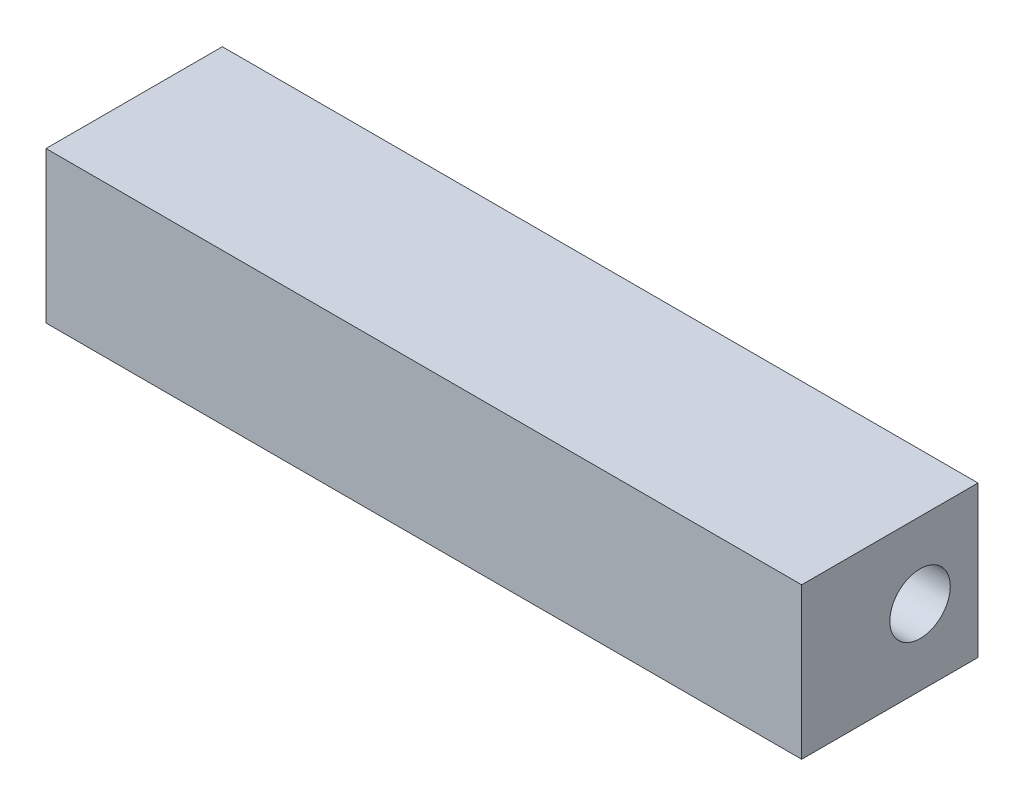
ISO-10303-21;
HEADER;
FILE_DESCRIPTION(('STEP AP214'),'2;1');
FILE_NAME('part.step','',(''),(''),'','','');
FILE_SCHEMA(('AUTOMOTIVE_DESIGN { 1 0 10303 214 1 1 1 1 }'));
ENDSEC;
DATA;
#1=APPLICATION_CONTEXT('core data for automotive mechanical design processes');
#2=APPLICATION_PROTOCOL_DEFINITION('international standard','automotive_design',2000,#1);
#3=PRODUCT_CONTEXT('',#1,'mechanical');
#4=PRODUCT('Part','Part','',(#3));
#5=PRODUCT_RELATED_PRODUCT_CATEGORY('part','',(#4));
#6=PRODUCT_DEFINITION_FORMATION('','',#4);
#7=PRODUCT_DEFINITION_CONTEXT('part definition',#1,'design');
#8=PRODUCT_DEFINITION('design','',#6,#7);
#9=PRODUCT_DEFINITION_SHAPE('','',#8);
#10=(LENGTH_UNIT() NAMED_UNIT(*) SI_UNIT(.MILLI.,.METRE.));
#11=(NAMED_UNIT(*) PLANE_ANGLE_UNIT() SI_UNIT($,.RADIAN.));
#12=(NAMED_UNIT(*) SI_UNIT($,.STERADIAN.) SOLID_ANGLE_UNIT());
#13=UNCERTAINTY_MEASURE_WITH_UNIT(LENGTH_MEASURE(1.E-05),#10,'distance_accuracy_value','');
#14=(GEOMETRIC_REPRESENTATION_CONTEXT(3) GLOBAL_UNCERTAINTY_ASSIGNED_CONTEXT((#13)) GLOBAL_UNIT_ASSIGNED_CONTEXT((#10,
#11,#12)) REPRESENTATION_CONTEXT('',''));
#15=CARTESIAN_POINT('',(0.,0.,0.));
#16=DIRECTION('',(0.,0.,1.));
#17=DIRECTION('',(1.,0.,0.));
#18=AXIS2_PLACEMENT_3D('',#15,#16,#17);
#19=CARTESIAN_POINT('',(64.6046049936581,25.,-7.80756572429295));
#20=DIRECTION('',(1.,0.,0.));
#21=DIRECTION('',(0.,0.,-1.));
#22=AXIS2_PLACEMENT_3D('',#19,#20,#21);
#23=PLANE('',#22);
#24=DIRECTION('',(0.,0.,-1.));
#25=VECTOR('',#24,1.);
#26=CARTESIAN_POINT('',(64.6046049936581,25.,-7.80756572429295));
#27=LINE('',#26,#25);
#28=CARTESIAN_POINT('',(64.6046049936581,25.,-7.80756572429295));
#29=VERTEX_POINT('',#28);
#30=CARTESIAN_POINT('',(64.6046049936581,25.,-11.307565724293));
#31=VERTEX_POINT('',#30);
#32=EDGE_CURVE('E158',#29,#31,#27,.T.);
#33=ORIENTED_EDGE('',*,*,#32,.T.);
#34=CARTESIAN_POINT('',(64.6046049936581,15.,-11.307565724293));
#35=DIRECTION('',(1.,0.,0.));
#36=DIRECTION('',(0.,0.,-1.));
#37=AXIS2_PLACEMENT_3D('',#34,#35,#36);
#38=CIRCLE('',#37,10.);
#39=CARTESIAN_POINT('',(64.6046049936581,24.3674969975976,-7.80756572429294));
#40=VERTEX_POINT('',#39);
#41=EDGE_CURVE('E120',#31,#40,#38,.T.);
#42=ORIENTED_EDGE('',*,*,#41,.T.);
#43=DIRECTION('',(0.,-1.,0.));
#44=VECTOR('',#43,1.);
#45=CARTESIAN_POINT('',(64.6046049936581,25.,-7.80756572429295));
#46=LINE('',#45,#44);
#47=EDGE_CURVE('E130',#29,#40,#46,.T.);
#48=ORIENTED_EDGE('',*,*,#47,.F.);
#49=EDGE_LOOP('',(#33,#42,#48));
#50=FACE_BOUND('',#49,.T.);
#51=ADVANCED_FACE('F37',(#50),#23,.F.);
#52=CARTESIAN_POINT('',(0.,0.,-7.80756572429294));
#53=DIRECTION('',(0.,0.,1.));
#54=DIRECTION('',(1.,0.,0.));
#55=AXIS2_PLACEMENT_3D('',#52,#53,#54);
#56=PLANE('',#55);
#57=DIRECTION('',(0.,1.,0.));
#58=VECTOR('',#57,1.);
#59=CARTESIAN_POINT('',(-15.3953950063419,25.,-7.80756572429294));
#60=LINE('',#59,#58);
#61=CARTESIAN_POINT('',(-15.3953950063419,0.,-7.80756572429294));
#62=VERTEX_POINT('',#61);
#63=CARTESIAN_POINT('',(-15.3953950063419,5.6325030024024,-7.80756572429294));
#64=VERTEX_POINT('',#63);
#65=EDGE_CURVE('E136',#62,#64,#60,.T.);
#66=ORIENTED_EDGE('',*,*,#65,.T.);
#67=DIRECTION('',(1.,0.,0.));
#68=VECTOR('',#67,1.);
#69=CARTESIAN_POINT('',(-15.3953950063419,5.6325030024024,-7.80756572429294));
#70=LINE('',#69,#68);
#71=CARTESIAN_POINT('',(64.6046049936581,5.6325030024024,-7.80756572429294));
#72=VERTEX_POINT('',#71);
#73=EDGE_CURVE('E11',#64,#72,#70,.T.);
#74=ORIENTED_EDGE('',*,*,#73,.T.);
#75=CARTESIAN_POINT('',(64.6046049936581,0.,-7.80756572429296));
#76=VERTEX_POINT('',#75);
#77=EDGE_CURVE('E59',#72,#76,#46,.T.);
#78=ORIENTED_EDGE('',*,*,#77,.T.);
#79=DIRECTION('',(-1.,0.,0.));
#80=VECTOR('',#79,1.);
#81=CARTESIAN_POINT('',(64.6046049936581,0.,-7.80756572429295));
#82=LINE('',#81,#80);
#83=EDGE_CURVE('E137',#76,#62,#82,.T.);
#84=ORIENTED_EDGE('',*,*,#83,.T.);
#85=EDGE_LOOP('',(#66,#74,#78,#84));
#86=FACE_BOUND('',#85,.T.);
#87=ADVANCED_FACE('F223',(#86),#56,.F.);
#88=CARTESIAN_POINT('',(99.6046049936581,30.,-22.807565724293));
#89=DIRECTION('',(1.,0.,0.));
#90=DIRECTION('',(0.,0.,-1.));
#91=AXIS2_PLACEMENT_3D('',#88,#89,#90);
#92=PLANE('',#91);
#93=CARTESIAN_POINT('',(99.6046049936581,15.,-11.307565724293));
#94=DIRECTION('',(1.,0.,0.));
#95=DIRECTION('',(0.,0.,-1.));
#96=AXIS2_PLACEMENT_3D('',#93,#94,#95);
#97=CIRCLE('',#96,6.);
#98=CARTESIAN_POINT('',(99.6046049936581,15.,-17.307565724293));
#99=VERTEX_POINT('',#98);
#100=EDGE_CURVE('E157',#99,#99,#97,.T.);
#101=ORIENTED_EDGE('',*,*,#100,.F.);
#102=EDGE_LOOP('',(#101));
#103=FACE_BOUND('',#102,.T.);
#104=DIRECTION('',(0.,0.,1.));
#105=VECTOR('',#104,1.);
#106=CARTESIAN_POINT('',(99.6046049936581,0.,-22.807565724293));
#107=LINE('',#106,#105);
#108=CARTESIAN_POINT('',(99.6046049936581,0.,-22.807565724293));
#109=VERTEX_POINT('',#108);
#110=CARTESIAN_POINT('',(99.6046049936581,0.,12.1924342757071));
#111=VERTEX_POINT('',#110);
#112=EDGE_CURVE('E166',#109,#111,#107,.T.);
#113=ORIENTED_EDGE('',*,*,#112,.F.);
#114=DIRECTION('',(0.,-1.,0.));
#115=VECTOR('',#114,1.);
#116=CARTESIAN_POINT('',(99.6046049936581,30.,-22.807565724293));
#117=LINE('',#116,#115);
#118=CARTESIAN_POINT('',(99.6046049936581,30.,-22.807565724293));
#119=VERTEX_POINT('',#118);
#120=EDGE_CURVE('E131',#119,#109,#117,.T.);
#121=ORIENTED_EDGE('',*,*,#120,.F.);
#122=DIRECTION('',(0.,0.,1.));
#123=VECTOR('',#122,1.);
#124=CARTESIAN_POINT('',(99.6046049936581,30.,-22.807565724293));
#125=LINE('',#124,#123);
#126=CARTESIAN_POINT('',(99.6046049936581,30.,12.1924342757071));
#127=VERTEX_POINT('',#126);
#128=EDGE_CURVE('E167',#119,#127,#125,.T.);
#129=ORIENTED_EDGE('',*,*,#128,.T.);
#130=DIRECTION('',(0.,-1.,0.));
#131=VECTOR('',#130,1.);
#132=CARTESIAN_POINT('',(99.6046049936581,30.,12.1924342757071));
#133=LINE('',#132,#131);
#134=EDGE_CURVE('E178',#127,#111,#133,.T.);
#135=ORIENTED_EDGE('',*,*,#134,.T.);
#136=EDGE_LOOP('',(#113,#121,#129,#135));
#137=FACE_BOUND('',#136,.T.);
#138=ADVANCED_FACE('F39',(#103,#137),#92,.T.);
#139=CARTESIAN_POINT('',(99.6046049936581,30.,-22.807565724293));
#140=DIRECTION('',(0.,0.,1.));
#141=DIRECTION('',(1.,0.,0.));
#142=AXIS2_PLACEMENT_3D('',#139,#140,#141);
#143=PLANE('',#142);
#144=DIRECTION('',(-1.,0.,0.));
#145=VECTOR('',#144,1.);
#146=CARTESIAN_POINT('',(99.6046049936581,0.,-22.807565724293));
#147=LINE('',#146,#145);
#148=CARTESIAN_POINT('',(64.6046049936581,0.,-22.807565724293));
#149=VERTEX_POINT('',#148);
#150=EDGE_CURVE('E171',#109,#149,#147,.T.);
#151=ORIENTED_EDGE('',*,*,#150,.T.);
#152=DIRECTION('',(0.,-1.,0.));
#153=VECTOR('',#152,1.);
#154=CARTESIAN_POINT('',(64.6046049936581,25.,-22.807565724293));
#155=LINE('',#154,#153);
#156=CARTESIAN_POINT('',(64.6046049936581,25.,-22.807565724293));
#157=VERTEX_POINT('',#156);
#158=EDGE_CURVE('E140',#157,#149,#155,.T.);
#159=ORIENTED_EDGE('',*,*,#158,.F.);
#160=DIRECTION('',(1.,0.,0.));
#161=VECTOR('',#160,1.);
#162=CARTESIAN_POINT('',(64.6046049936581,25.,-22.807565724293));
#163=LINE('',#162,#161);
#164=CARTESIAN_POINT('',(-15.3953950063419,25.,-22.8075657242929));
#165=VERTEX_POINT('',#164);
#166=EDGE_CURVE('E149',#165,#157,#163,.T.);
#167=ORIENTED_EDGE('',*,*,#166,.F.);
#168=DIRECTION('',(0.,1.,0.));
#169=VECTOR('',#168,1.);
#170=CARTESIAN_POINT('',(-15.3953950063419,25.,-22.8075657242929));
#171=LINE('',#170,#169);
#172=CARTESIAN_POINT('',(-15.3953950063419,0.,-22.8075657242929));
#173=VERTEX_POINT('',#172);
#174=EDGE_CURVE('E147',#173,#165,#171,.T.);
#175=ORIENTED_EDGE('',*,*,#174,.F.);
#176=CARTESIAN_POINT('',(-50.3953950062558,0.,-22.8075657242929));
#177=VERTEX_POINT('',#176);
#178=EDGE_CURVE('E187',#173,#177,#147,.T.);
#179=ORIENTED_EDGE('',*,*,#178,.T.);
#180=DIRECTION('',(0.,-1.,0.));
#181=VECTOR('',#180,1.);
#182=CARTESIAN_POINT('',(-50.3953950062558,30.,-22.8075657242929));
#183=LINE('',#182,#181);
#184=CARTESIAN_POINT('',(-50.3953950062558,30.,-22.8075657242929));
#185=VERTEX_POINT('',#184);
#186=EDGE_CURVE('E191',#185,#177,#183,.T.);
#187=ORIENTED_EDGE('',*,*,#186,.F.);
#188=DIRECTION('',(-1.,0.,0.));
#189=VECTOR('',#188,1.);
#190=CARTESIAN_POINT('',(99.6046049936581,30.,-22.807565724293));
#191=LINE('',#190,#189);
#192=EDGE_CURVE('E176',#119,#185,#191,.T.);
#193=ORIENTED_EDGE('',*,*,#192,.F.);
#194=ORIENTED_EDGE('',*,*,#120,.T.);
#195=EDGE_LOOP('',(#151,#159,#167,#175,#179,#187,#193,#194));
#196=FACE_BOUND('',#195,.T.);
#197=ADVANCED_FACE('F211',(#196),#143,.F.);
#198=CARTESIAN_POINT('',(-50.3953950062558,30.,-22.8075657242929));
#199=DIRECTION('',(1.,0.,0.));
#200=DIRECTION('',(0.,0.,-1.));
#201=AXIS2_PLACEMENT_3D('',#198,#199,#200);
#202=PLANE('',#201);
#203=DIRECTION('',(0.,0.,1.));
#204=VECTOR('',#203,1.);
#205=CARTESIAN_POINT('',(-50.3953950062558,0.,-22.8075657242929));
#206=LINE('',#205,#204);
#207=CARTESIAN_POINT('',(-50.3953950062558,0.,12.1924342757071));
#208=VERTEX_POINT('',#207);
#209=EDGE_CURVE('E184',#177,#208,#206,.T.);
#210=ORIENTED_EDGE('',*,*,#209,.T.);
#211=DIRECTION('',(0.,-1.,0.));
#212=VECTOR('',#211,1.);
#213=CARTESIAN_POINT('',(-50.3953950062558,30.,12.1924342757071));
#214=LINE('',#213,#212);
#215=CARTESIAN_POINT('',(-50.3953950062558,30.,12.1924342757071));
#216=VERTEX_POINT('',#215);
#217=EDGE_CURVE('E194',#216,#208,#214,.T.);
#218=ORIENTED_EDGE('',*,*,#217,.F.);
#219=DIRECTION('',(0.,0.,1.));
#220=VECTOR('',#219,1.);
#221=CARTESIAN_POINT('',(-50.3953950062558,30.,-22.8075657242929));
#222=LINE('',#221,#220);
#223=EDGE_CURVE('E174',#185,#216,#222,.T.);
#224=ORIENTED_EDGE('',*,*,#223,.F.);
#225=ORIENTED_EDGE('',*,*,#186,.T.);
#226=EDGE_LOOP('',(#210,#218,#224,#225));
#227=FACE_BOUND('',#226,.T.);
#228=ADVANCED_FACE('F219',(#227),#202,.F.);
#229=CARTESIAN_POINT('',(99.6046049936581,30.,12.1924342757071));
#230=DIRECTION('',(0.,0.,1.));
#231=DIRECTION('',(1.,0.,0.));
#232=AXIS2_PLACEMENT_3D('',#229,#230,#231);
#233=PLANE('',#232);
#234=DIRECTION('',(-1.,0.,0.));
#235=VECTOR('',#234,1.);
#236=CARTESIAN_POINT('',(99.6046049936581,0.,12.1924342757071));
#237=LINE('',#236,#235);
#238=EDGE_CURVE('E181',#111,#208,#237,.T.);
#239=ORIENTED_EDGE('',*,*,#238,.F.);
#240=ORIENTED_EDGE('',*,*,#134,.F.);
#241=DIRECTION('',(-1.,0.,0.));
#242=VECTOR('',#241,1.);
#243=CARTESIAN_POINT('',(99.6046049936581,30.,12.1924342757071));
#244=LINE('',#243,#242);
#245=EDGE_CURVE('E170',#127,#216,#244,.T.);
#246=ORIENTED_EDGE('',*,*,#245,.T.);
#247=ORIENTED_EDGE('',*,*,#217,.T.);
#248=EDGE_LOOP('',(#239,#240,#246,#247));
#249=FACE_BOUND('',#248,.T.);
#250=ADVANCED_FACE('F202',(#249),#233,.T.);
#251=CARTESIAN_POINT('',(0.,30.,0.));
#252=DIRECTION('',(0.,-1.,0.));
#253=DIRECTION('',(0.,0.,-1.));
#254=AXIS2_PLACEMENT_3D('',#251,#252,#253);
#255=PLANE('',#254);
#256=ORIENTED_EDGE('',*,*,#128,.F.);
#257=ORIENTED_EDGE('',*,*,#192,.T.);
#258=ORIENTED_EDGE('',*,*,#223,.T.);
#259=ORIENTED_EDGE('',*,*,#245,.F.);
#260=EDGE_LOOP('',(#256,#257,#258,#259));
#261=FACE_BOUND('',#260,.T.);
#262=ADVANCED_FACE('F217',(#261),#255,.F.);
#263=CARTESIAN_POINT('',(0.,0.,0.));
#264=DIRECTION('',(0.,-1.,0.));
#265=DIRECTION('',(0.,0.,-1.));
#266=AXIS2_PLACEMENT_3D('',#263,#264,#265);
#267=PLANE('',#266);
#268=DIRECTION('',(0.,0.,-1.));
#269=VECTOR('',#268,1.);
#270=CARTESIAN_POINT('',(64.6046049936581,0.,-7.80756572429295));
#271=LINE('',#270,#269);
#272=EDGE_CURVE('E154',#76,#149,#271,.T.);
#273=ORIENTED_EDGE('',*,*,#272,.T.);
#274=ORIENTED_EDGE('',*,*,#150,.F.);
#275=ORIENTED_EDGE('',*,*,#112,.T.);
#276=ORIENTED_EDGE('',*,*,#238,.T.);
#277=ORIENTED_EDGE('',*,*,#209,.F.);
#278=ORIENTED_EDGE('',*,*,#178,.F.);
#279=DIRECTION('',(0.,0.,-1.));
#280=VECTOR('',#279,1.);
#281=CARTESIAN_POINT('',(-15.3953950063419,0.,-7.80756572429294));
#282=LINE('',#281,#280);
#283=EDGE_CURVE('E146',#62,#173,#282,.T.);
#284=ORIENTED_EDGE('',*,*,#283,.F.);
#285=ORIENTED_EDGE('',*,*,#83,.F.);
#286=EDGE_LOOP('',(#273,#274,#275,#276,#277,#278,#284,#285));
#287=FACE_BOUND('',#286,.T.);
#288=ADVANCED_FACE('F207',(#287),#267,.T.);
#289=CARTESIAN_POINT('',(79.6046049936581,15.,-11.307565724293));
#290=DIRECTION('',(1.,0.,0.));
#291=DIRECTION('',(0.,0.,-1.));
#292=AXIS2_PLACEMENT_3D('',#289,#290,#291);
#293=CYLINDRICAL_SURFACE('',#292,6.);
#294=CARTESIAN_POINT('',(79.6046049936581,15.,-11.307565724293));
#295=DIRECTION('',(1.,0.,0.));
#296=DIRECTION('',(0.,0.,-1.));
#297=AXIS2_PLACEMENT_3D('',#294,#295,#296);
#298=CIRCLE('',#297,6.);
#299=CARTESIAN_POINT('',(79.6046049936581,15.,-17.307565724293));
#300=VERTEX_POINT('',#299);
#301=EDGE_CURVE('E150',#300,#300,#298,.F.);
#302=ORIENTED_EDGE('',*,*,#301,.T.);
#303=EDGE_LOOP('',(#302));
#304=FACE_BOUND('',#303,.T.);
#305=ORIENTED_EDGE('',*,*,#100,.T.);
#306=EDGE_LOOP('',(#305));
#307=FACE_BOUND('',#306,.T.);
#308=ADVANCED_FACE('F253',(#304,#307),#293,.F.);
#309=ORIENTED_EDGE('',*,*,#77,.F.);
#310=EDGE_CURVE('E353',#72,#31,#38,.T.);
#311=ORIENTED_EDGE('',*,*,#310,.T.);
#312=EDGE_CURVE('E161',#31,#157,#27,.T.);
#313=ORIENTED_EDGE('',*,*,#312,.T.);
#314=ORIENTED_EDGE('',*,*,#158,.T.);
#315=ORIENTED_EDGE('',*,*,#272,.F.);
#316=EDGE_LOOP('',(#309,#311,#313,#314,#315));
#317=FACE_BOUND('',#316,.T.);
#318=ADVANCED_FACE('F233',(#317),#23,.F.);
#319=CARTESIAN_POINT('',(64.6046049936581,25.,-7.80756572429295));
#320=DIRECTION('',(0.,1.,0.));
#321=DIRECTION('',(0.,0.,1.));
#322=AXIS2_PLACEMENT_3D('',#319,#320,#321);
#323=PLANE('',#322);
#324=DIRECTION('',(0.,0.,-1.));
#325=VECTOR('',#324,1.);
#326=CARTESIAN_POINT('',(-15.3953950063419,25.,-7.80756572429294));
#327=LINE('',#326,#325);
#328=CARTESIAN_POINT('',(-15.3953950063419,25.,-7.80756572429294));
#329=VERTEX_POINT('',#328);
#330=EDGE_CURVE('E134',#329,#165,#327,.T.);
#331=ORIENTED_EDGE('',*,*,#330,.T.);
#332=ORIENTED_EDGE('',*,*,#166,.T.);
#333=ORIENTED_EDGE('',*,*,#312,.F.);
#334=ORIENTED_EDGE('',*,*,#32,.F.);
#335=DIRECTION('',(1.,0.,0.));
#336=VECTOR('',#335,1.);
#337=CARTESIAN_POINT('',(64.6046049936581,25.,-7.80756572429295));
#338=LINE('',#337,#336);
#339=EDGE_CURVE('E139',#329,#29,#338,.T.);
#340=ORIENTED_EDGE('',*,*,#339,.F.);
#341=EDGE_LOOP('',(#331,#332,#333,#334,#340));
#342=FACE_BOUND('',#341,.T.);
#343=ADVANCED_FACE('F243',(#342),#323,.F.);
#344=CARTESIAN_POINT('',(-15.3953950063419,25.,-7.80756572429294));
#345=DIRECTION('',(-1.,0.,0.));
#346=DIRECTION('',(0.,0.,1.));
#347=AXIS2_PLACEMENT_3D('',#344,#345,#346);
#348=PLANE('',#347);
#349=CARTESIAN_POINT('',(-15.3953950063419,15.,-11.307565724293));
#350=DIRECTION('',(1.,0.,0.));
#351=DIRECTION('',(0.,0.,-1.));
#352=AXIS2_PLACEMENT_3D('',#349,#350,#351);
#353=CIRCLE('',#352,6.);
#354=CARTESIAN_POINT('',(-15.3953950063419,15.,-17.307565724293));
#355=VERTEX_POINT('',#354);
#356=EDGE_CURVE('E346',#355,#355,#353,.T.);
#357=ORIENTED_EDGE('',*,*,#356,.F.);
#358=EDGE_LOOP('',(#357));
#359=FACE_BOUND('',#358,.T.);
#360=ORIENTED_EDGE('',*,*,#174,.T.);
#361=ORIENTED_EDGE('',*,*,#330,.F.);
#362=CARTESIAN_POINT('',(-15.3953950063419,24.3674969975976,-7.80756572429294));
#363=VERTEX_POINT('',#362);
#364=EDGE_CURVE('E127',#363,#329,#60,.T.);
#365=ORIENTED_EDGE('',*,*,#364,.F.);
#366=CARTESIAN_POINT('',(-15.3953950063419,15.,-11.307565724293));
#367=DIRECTION('',(1.,0.,0.));
#368=DIRECTION('',(0.,0.,-1.));
#369=AXIS2_PLACEMENT_3D('',#366,#367,#368);
#370=CIRCLE('',#369,10.);
#371=EDGE_CURVE('E52',#363,#64,#370,.T.);
#372=ORIENTED_EDGE('',*,*,#371,.T.);
#373=ORIENTED_EDGE('',*,*,#65,.F.);
#374=ORIENTED_EDGE('',*,*,#283,.T.);
#375=EDGE_LOOP('',(#360,#361,#365,#372,#373,#374));
#376=FACE_BOUND('',#375,.T.);
#377=ADVANCED_FACE('F133',(#359,#376),#348,.F.);
#378=ORIENTED_EDGE('',*,*,#47,.T.);
#379=DIRECTION('',(1.,0.,0.));
#380=VECTOR('',#379,1.);
#381=CARTESIAN_POINT('',(-15.3953950063419,24.3674969975976,-7.80756572429294));
#382=LINE('',#381,#380);
#383=EDGE_CURVE('E45',#40,#363,#382,.F.);
#384=ORIENTED_EDGE('',*,*,#383,.T.);
#385=ORIENTED_EDGE('',*,*,#364,.T.);
#386=ORIENTED_EDGE('',*,*,#339,.T.);
#387=EDGE_LOOP('',(#378,#384,#385,#386));
#388=FACE_BOUND('',#387,.T.);
#389=ADVANCED_FACE('F125',(#388),#56,.F.);
#390=CARTESIAN_POINT('',(79.6046049936581,15.,-11.307565724293));
#391=DIRECTION('',(1.,0.,0.));
#392=DIRECTION('',(0.,0.,-1.));
#393=AXIS2_PLACEMENT_3D('',#390,#391,#392);
#394=PLANE('',#393);
#395=CARTESIAN_POINT('',(79.6046049936581,15.,-11.307565724293));
#396=DIRECTION('',(1.,0.,0.));
#397=DIRECTION('',(0.,0.,-1.));
#398=AXIS2_PLACEMENT_3D('',#395,#396,#397);
#399=CIRCLE('',#398,10.);
#400=CARTESIAN_POINT('',(79.6046049936581,15.,-21.307565724293));
#401=VERTEX_POINT('',#400);
#402=EDGE_CURVE('E121',#401,#401,#399,.T.);
#403=ORIENTED_EDGE('',*,*,#402,.F.);
#404=EDGE_LOOP('',(#403));
#405=FACE_BOUND('',#404,.T.);
#406=ORIENTED_EDGE('',*,*,#301,.F.);
#407=EDGE_LOOP('',(#406));
#408=FACE_BOUND('',#407,.T.);
#409=ADVANCED_FACE('F236',(#405,#408),#394,.F.);
#410=CARTESIAN_POINT('',(-15.3953950063419,15.,-11.307565724293));
#411=DIRECTION('',(1.,0.,0.));
#412=DIRECTION('',(0.,0.,-1.));
#413=AXIS2_PLACEMENT_3D('',#410,#411,#412);
#414=CYLINDRICAL_SURFACE('',#413,10.);
#415=ORIENTED_EDGE('',*,*,#402,.T.);
#416=EDGE_LOOP('',(#415));
#417=FACE_BOUND('',#416,.T.);
#418=ORIENTED_EDGE('',*,*,#73,.F.);
#419=ORIENTED_EDGE('',*,*,#371,.F.);
#420=ORIENTED_EDGE('',*,*,#383,.F.);
#421=ORIENTED_EDGE('',*,*,#41,.F.);
#422=ORIENTED_EDGE('',*,*,#310,.F.);
#423=EDGE_LOOP('',(#418,#419,#420,#421,#422));
#424=FACE_BOUND('',#423,.T.);
#425=ADVANCED_FACE('F117',(#417,#424),#414,.F.);
#426=CARTESIAN_POINT('',(-40.3953950063419,15.,-11.3075657242929));
#427=DIRECTION('',(1.,0.,0.));
#428=DIRECTION('',(0.,0.,-1.));
#429=AXIS2_PLACEMENT_3D('',#426,#427,#428);
#430=CYLINDRICAL_SURFACE('',#429,6.);
#431=CARTESIAN_POINT('',(-40.3953950063419,15.,-11.3075657242929));
#432=DIRECTION('',(1.,0.,0.));
#433=DIRECTION('',(0.,0.,-1.));
#434=AXIS2_PLACEMENT_3D('',#431,#432,#433);
#435=CIRCLE('',#434,6.);
#436=CARTESIAN_POINT('',(-40.3953950063419,15.,-17.3075657242929));
#437=VERTEX_POINT('',#436);
#438=EDGE_CURVE('E345',#437,#437,#435,.T.);
#439=ORIENTED_EDGE('',*,*,#438,.F.);
#440=EDGE_LOOP('',(#439));
#441=FACE_BOUND('',#440,.T.);
#442=ORIENTED_EDGE('',*,*,#356,.T.);
#443=EDGE_LOOP('',(#442));
#444=FACE_BOUND('',#443,.T.);
#445=ADVANCED_FACE('F315',(#441,#444),#430,.F.);
#446=CARTESIAN_POINT('',(-40.3953950063419,15.,-11.3075657242929));
#447=DIRECTION('',(1.,0.,0.));
#448=DIRECTION('',(0.,0.,-1.));
#449=AXIS2_PLACEMENT_3D('',#446,#447,#448);
#450=PLANE('',#449);
#451=ORIENTED_EDGE('',*,*,#438,.T.);
#452=EDGE_LOOP('',(#451));
#453=FACE_BOUND('',#452,.T.);
#454=ADVANCED_FACE('F329',(#453),#450,.T.);
#455=CLOSED_SHELL('',(#51,#87,#138,#197,#228,#250,#262,#288,#308,#318,#343,#377,#389,#409,#425,
#445,#454));
#456=MANIFOLD_SOLID_BREP('B2',#455);
#457=ADVANCED_BREP_SHAPE_REPRESENTATION('',(#18,#456),#14);
#458=SHAPE_DEFINITION_REPRESENTATION(#9,#457);
ENDSEC;
END-ISO-10303-21;
